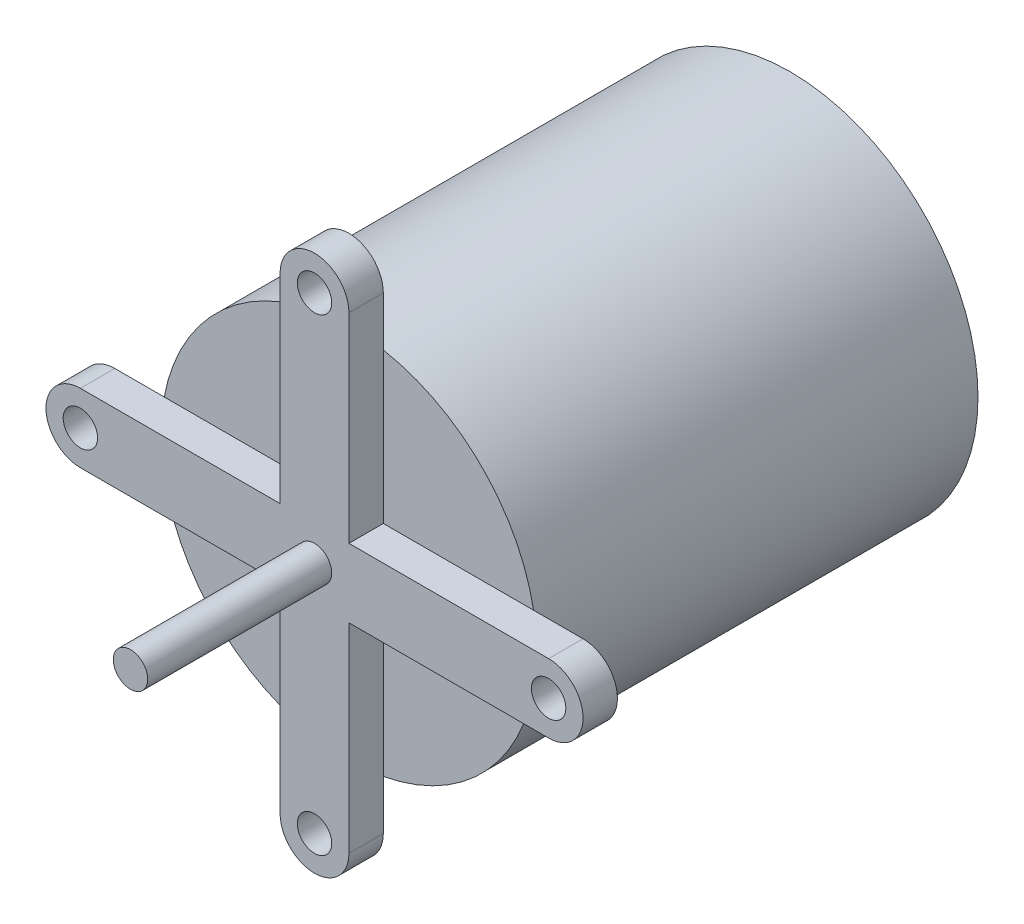
ISO-10303-21;
HEADER;
FILE_DESCRIPTION(('STEP AP214'),'2;1');
FILE_NAME('part.step','',(''),(''),'','','');
FILE_SCHEMA(('AUTOMOTIVE_DESIGN { 1 0 10303 214 1 1 1 1 }'));
ENDSEC;
DATA;
#1=APPLICATION_CONTEXT('core data for automotive mechanical design processes');
#2=APPLICATION_PROTOCOL_DEFINITION('international standard','automotive_design',2000,#1);
#3=PRODUCT_CONTEXT('',#1,'mechanical');
#4=PRODUCT('Part','Part','',(#3));
#5=PRODUCT_RELATED_PRODUCT_CATEGORY('part','',(#4));
#6=PRODUCT_DEFINITION_FORMATION('','',#4);
#7=PRODUCT_DEFINITION_CONTEXT('part definition',#1,'design');
#8=PRODUCT_DEFINITION('design','',#6,#7);
#9=PRODUCT_DEFINITION_SHAPE('','',#8);
#10=(LENGTH_UNIT() NAMED_UNIT(*) SI_UNIT(.MILLI.,.METRE.));
#11=(NAMED_UNIT(*) PLANE_ANGLE_UNIT() SI_UNIT($,.RADIAN.));
#12=(NAMED_UNIT(*) SI_UNIT($,.STERADIAN.) SOLID_ANGLE_UNIT());
#13=UNCERTAINTY_MEASURE_WITH_UNIT(LENGTH_MEASURE(1.E-05),#10,'distance_accuracy_value','');
#14=(GEOMETRIC_REPRESENTATION_CONTEXT(3) GLOBAL_UNCERTAINTY_ASSIGNED_CONTEXT((#13)) GLOBAL_UNIT_ASSIGNED_CONTEXT((#10,
#11,#12)) REPRESENTATION_CONTEXT('',''));
#15=CARTESIAN_POINT('',(0.,0.,0.));
#16=DIRECTION('',(0.,0.,1.));
#17=DIRECTION('',(1.,0.,0.));
#18=AXIS2_PLACEMENT_3D('',#15,#16,#17);
#19=CARTESIAN_POINT('',(0.,0.,25.654));
#20=DIRECTION('',(0.,0.,1.));
#21=DIRECTION('',(1.,0.,0.));
#22=AXIS2_PLACEMENT_3D('',#19,#20,#21);
#23=PLANE('',#22);
#24=CARTESIAN_POINT('',(0.,0.,25.654));
#25=DIRECTION('',(0.,0.,1.));
#26=DIRECTION('',(1.,0.,0.));
#27=AXIS2_PLACEMENT_3D('',#24,#25,#26);
#28=CIRCLE('',#27,10.922);
#29=CARTESIAN_POINT('',(10.7373227575585,1.999996,25.654));
#30=VERTEX_POINT('',#29);
#31=CARTESIAN_POINT('',(1.999996,10.7373227575585,25.654));
#32=VERTEX_POINT('',#31);
#33=EDGE_CURVE('E287',#30,#32,#28,.T.);
#34=ORIENTED_EDGE('',*,*,#33,.T.);
#35=DIRECTION('',(0.,-1.,0.));
#36=VECTOR('',#35,1.);
#37=CARTESIAN_POINT('',(1.999996,0.,25.654));
#38=LINE('',#37,#36);
#39=CARTESIAN_POINT('',(1.999996,1.999996,25.654));
#40=VERTEX_POINT('',#39);
#41=EDGE_CURVE('E11',#32,#40,#38,.T.);
#42=ORIENTED_EDGE('',*,*,#41,.T.);
#43=DIRECTION('',(-1.,0.,0.));
#44=VECTOR('',#43,1.);
#45=CARTESIAN_POINT('',(0.,1.999996,25.654));
#46=LINE('',#45,#44);
#47=EDGE_CURVE('E45',#30,#40,#46,.T.);
#48=ORIENTED_EDGE('',*,*,#47,.F.);
#49=EDGE_LOOP('',(#34,#42,#48));
#50=FACE_BOUND('',#49,.T.);
#51=ADVANCED_FACE('F36',(#50),#23,.T.);
#52=CARTESIAN_POINT('',(1.99999600000026,-10.7373227575585,25.654));
#53=VERTEX_POINT('',#52);
#54=CARTESIAN_POINT('',(10.7373227575585,-1.999996,25.654));
#55=VERTEX_POINT('',#54);
#56=EDGE_CURVE('E294',#53,#55,#28,.T.);
#57=ORIENTED_EDGE('',*,*,#56,.T.);
#58=DIRECTION('',(-1.,0.,0.));
#59=VECTOR('',#58,1.);
#60=CARTESIAN_POINT('',(0.,-1.999996,25.654));
#61=LINE('',#60,#59);
#62=CARTESIAN_POINT('',(1.99999600000026,-1.999996,25.654));
#63=VERTEX_POINT('',#62);
#64=EDGE_CURVE('E60',#55,#63,#61,.T.);
#65=ORIENTED_EDGE('',*,*,#64,.T.);
#66=DIRECTION('',(0.,1.,0.));
#67=VECTOR('',#66,1.);
#68=CARTESIAN_POINT('',(1.99999600000026,0.,25.654));
#69=LINE('',#68,#67);
#70=EDGE_CURVE('E245',#53,#63,#69,.T.);
#71=ORIENTED_EDGE('',*,*,#70,.F.);
#72=EDGE_LOOP('',(#57,#65,#71));
#73=FACE_BOUND('',#72,.T.);
#74=ADVANCED_FACE('F381',(#73),#23,.T.);
#75=CARTESIAN_POINT('',(-10.7373227575585,-1.999996,25.654));
#76=VERTEX_POINT('',#75);
#77=CARTESIAN_POINT('',(-1.9999959999998,-10.7373227575585,25.654));
#78=VERTEX_POINT('',#77);
#79=EDGE_CURVE('E300',#76,#78,#28,.T.);
#80=ORIENTED_EDGE('',*,*,#79,.T.);
#81=DIRECTION('',(0.,1.,0.));
#82=VECTOR('',#81,1.);
#83=CARTESIAN_POINT('',(-1.99999600000004,0.,25.654));
#84=LINE('',#83,#82);
#85=CARTESIAN_POINT('',(-1.99999599999999,-1.999996,25.654));
#86=VERTEX_POINT('',#85);
#87=EDGE_CURVE('E239',#78,#86,#84,.T.);
#88=ORIENTED_EDGE('',*,*,#87,.T.);
#89=DIRECTION('',(1.,0.,0.));
#90=VECTOR('',#89,1.);
#91=CARTESIAN_POINT('',(0.,-1.999996,25.654));
#92=LINE('',#91,#90);
#93=EDGE_CURVE('E235',#76,#86,#92,.T.);
#94=ORIENTED_EDGE('',*,*,#93,.F.);
#95=EDGE_LOOP('',(#80,#88,#94));
#96=FACE_BOUND('',#95,.T.);
#97=ADVANCED_FACE('F386',(#96),#23,.T.);
#98=CARTESIAN_POINT('',(-1.999996,10.7373227575585,25.654));
#99=VERTEX_POINT('',#98);
#100=CARTESIAN_POINT('',(-10.7373227575585,1.999996,25.654));
#101=VERTEX_POINT('',#100);
#102=EDGE_CURVE('E309',#99,#101,#28,.T.);
#103=ORIENTED_EDGE('',*,*,#102,.T.);
#104=DIRECTION('',(1.,0.,0.));
#105=VECTOR('',#104,1.);
#106=CARTESIAN_POINT('',(0.,1.999996,25.654));
#107=LINE('',#106,#105);
#108=CARTESIAN_POINT('',(-1.999996,1.999996,25.654));
#109=VERTEX_POINT('',#108);
#110=EDGE_CURVE('E229',#101,#109,#107,.T.);
#111=ORIENTED_EDGE('',*,*,#110,.T.);
#112=DIRECTION('',(0.,-1.,0.));
#113=VECTOR('',#112,1.);
#114=CARTESIAN_POINT('',(-1.999996,0.,25.654));
#115=LINE('',#114,#113);
#116=EDGE_CURVE('E225',#99,#109,#115,.T.);
#117=ORIENTED_EDGE('',*,*,#116,.F.);
#118=EDGE_LOOP('',(#103,#111,#117));
#119=FACE_BOUND('',#118,.T.);
#120=ADVANCED_FACE('F364',(#119),#23,.T.);
#121=CARTESIAN_POINT('',(0.,0.,25.654));
#122=DIRECTION('',(0.,0.,-1.));
#123=DIRECTION('',(-1.,0.,0.));
#124=AXIS2_PLACEMENT_3D('',#121,#122,#123);
#125=CYLINDRICAL_SURFACE('',#124,10.922);
#126=ORIENTED_EDGE('',*,*,#33,.F.);
#127=EDGE_CURVE('E289',#55,#30,#28,.T.);
#128=ORIENTED_EDGE('',*,*,#127,.F.);
#129=ORIENTED_EDGE('',*,*,#56,.F.);
#130=EDGE_CURVE('E297',#78,#53,#28,.T.);
#131=ORIENTED_EDGE('',*,*,#130,.F.);
#132=ORIENTED_EDGE('',*,*,#79,.F.);
#133=EDGE_CURVE('E304',#101,#76,#28,.T.);
#134=ORIENTED_EDGE('',*,*,#133,.F.);
#135=ORIENTED_EDGE('',*,*,#102,.F.);
#136=EDGE_CURVE('E288',#32,#99,#28,.T.);
#137=ORIENTED_EDGE('',*,*,#136,.F.);
#138=EDGE_LOOP('',(#126,#128,#129,#131,#132,#134,#135,#137));
#139=FACE_BOUND('',#138,.T.);
#140=CARTESIAN_POINT('',(0.,0.,0.));
#141=DIRECTION('',(0.,0.,1.));
#142=DIRECTION('',(1.,0.,0.));
#143=AXIS2_PLACEMENT_3D('',#140,#141,#142);
#144=CIRCLE('',#143,10.922);
#145=CARTESIAN_POINT('',(10.922,0.,0.));
#146=VERTEX_POINT('',#145);
#147=EDGE_CURVE('E161',#146,#146,#144,.T.);
#148=ORIENTED_EDGE('',*,*,#147,.T.);
#149=EDGE_LOOP('',(#148));
#150=FACE_BOUND('',#149,.T.);
#151=ADVANCED_FACE('F38',(#139,#150),#125,.T.);
#152=CARTESIAN_POINT('',(0.,0.,0.));
#153=DIRECTION('',(0.,0.,1.));
#154=DIRECTION('',(1.,0.,0.));
#155=AXIS2_PLACEMENT_3D('',#152,#153,#154);
#156=PLANE('',#155);
#157=ORIENTED_EDGE('',*,*,#147,.F.);
#158=EDGE_LOOP('',(#157));
#159=FACE_BOUND('',#158,.T.);
#160=ADVANCED_FACE('F376',(#159),#156,.F.);
#161=CARTESIAN_POINT('',(0.,0.,25.654));
#162=DIRECTION('',(0.,0.,1.));
#163=DIRECTION('',(1.,0.,0.));
#164=AXIS2_PLACEMENT_3D('',#161,#162,#163);
#165=PLANE('',#164);
#166=CARTESIAN_POINT('',(0.,13.61180000012,25.654));
#167=DIRECTION('',(0.,0.,1.));
#168=DIRECTION('',(1.,0.,0.));
#169=AXIS2_PLACEMENT_3D('',#166,#167,#168);
#170=CIRCLE('',#169,1.00000054);
#171=CARTESIAN_POINT('',(1.00000054,13.61180000012,25.654));
#172=VERTEX_POINT('',#171);
#173=EDGE_CURVE('E253',#172,#172,#170,.T.);
#174=ORIENTED_EDGE('',*,*,#173,.T.);
#175=EDGE_LOOP('',(#174));
#176=FACE_BOUND('',#175,.T.);
#177=CARTESIAN_POINT('',(1.999996,13.61180000012,25.654));
#178=VERTEX_POINT('',#177);
#179=EDGE_CURVE('E47',#178,#32,#38,.T.);
#180=ORIENTED_EDGE('',*,*,#179,.T.);
#181=ORIENTED_EDGE('',*,*,#136,.T.);
#182=CARTESIAN_POINT('',(-1.999996,13.61180000012,25.654));
#183=VERTEX_POINT('',#182);
#184=EDGE_CURVE('E221',#183,#99,#115,.T.);
#185=ORIENTED_EDGE('',*,*,#184,.F.);
#186=CARTESIAN_POINT('',(0.,13.61180000012,25.654));
#187=DIRECTION('',(0.,0.,1.));
#188=DIRECTION('',(1.,0.,0.));
#189=AXIS2_PLACEMENT_3D('',#186,#187,#188);
#190=CIRCLE('',#189,1.999996);
#191=EDGE_CURVE('E219',#178,#183,#190,.T.);
#192=ORIENTED_EDGE('',*,*,#191,.F.);
#193=EDGE_LOOP('',(#180,#181,#185,#192));
#194=FACE_BOUND('',#193,.T.);
#195=ADVANCED_FACE('F319',(#176,#194),#165,.F.);
#196=CARTESIAN_POINT('',(-13.61180000012,0.,25.654));
#197=DIRECTION('',(0.,0.,1.));
#198=DIRECTION('',(1.,0.,0.));
#199=AXIS2_PLACEMENT_3D('',#196,#197,#198);
#200=CIRCLE('',#199,1.00000053999996);
#201=CARTESIAN_POINT('',(-12.61179946012,0.,25.654));
#202=VERTEX_POINT('',#201);
#203=EDGE_CURVE('E180',#202,#202,#200,.T.);
#204=ORIENTED_EDGE('',*,*,#203,.T.);
#205=EDGE_LOOP('',(#204));
#206=FACE_BOUND('',#205,.T.);
#207=CARTESIAN_POINT('',(-13.61180000012,1.999996,25.654));
#208=VERTEX_POINT('',#207);
#209=EDGE_CURVE('E224',#208,#101,#107,.T.);
#210=ORIENTED_EDGE('',*,*,#209,.T.);
#211=ORIENTED_EDGE('',*,*,#133,.T.);
#212=CARTESIAN_POINT('',(-13.61180000012,-1.999996,25.654));
#213=VERTEX_POINT('',#212);
#214=EDGE_CURVE('E231',#213,#76,#92,.T.);
#215=ORIENTED_EDGE('',*,*,#214,.F.);
#216=CARTESIAN_POINT('',(-13.61180000012,0.,25.654));
#217=DIRECTION('',(0.,0.,1.));
#218=DIRECTION('',(1.,0.,0.));
#219=AXIS2_PLACEMENT_3D('',#216,#217,#218);
#220=CIRCLE('',#219,1.999996);
#221=EDGE_CURVE('E228',#208,#213,#220,.T.);
#222=ORIENTED_EDGE('',*,*,#221,.F.);
#223=EDGE_LOOP('',(#210,#211,#215,#222));
#224=FACE_BOUND('',#223,.T.);
#225=ADVANCED_FACE('F365',(#206,#224),#165,.F.);
#226=CARTESIAN_POINT('',(2.60344038888319E-13,-13.61180000012,25.654));
#227=DIRECTION('',(0.,0.,1.));
#228=DIRECTION('',(1.,0.,0.));
#229=AXIS2_PLACEMENT_3D('',#226,#227,#228);
#230=CIRCLE('',#229,1.00000054000016);
#231=CARTESIAN_POINT('',(1.00000054000042,-13.61180000012,25.654));
#232=VERTEX_POINT('',#231);
#233=EDGE_CURVE('E256',#232,#232,#230,.T.);
#234=ORIENTED_EDGE('',*,*,#233,.T.);
#235=EDGE_LOOP('',(#234));
#236=FACE_BOUND('',#235,.T.);
#237=CARTESIAN_POINT('',(-1.99999599999974,-13.61180000012,25.654));
#238=VERTEX_POINT('',#237);
#239=EDGE_CURVE('E234',#238,#78,#84,.T.);
#240=ORIENTED_EDGE('',*,*,#239,.T.);
#241=ORIENTED_EDGE('',*,*,#130,.T.);
#242=CARTESIAN_POINT('',(1.99999600000026,-13.61180000012,25.654));
#243=VERTEX_POINT('',#242);
#244=EDGE_CURVE('E241',#243,#53,#69,.T.);
#245=ORIENTED_EDGE('',*,*,#244,.F.);
#246=CARTESIAN_POINT('',(2.60344038888319E-13,-13.61180000012,25.654));
#247=DIRECTION('',(0.,0.,1.));
#248=DIRECTION('',(1.,0.,0.));
#249=AXIS2_PLACEMENT_3D('',#246,#247,#248);
#250=CIRCLE('',#249,1.999996);
#251=EDGE_CURVE('E238',#238,#243,#250,.T.);
#252=ORIENTED_EDGE('',*,*,#251,.F.);
#253=EDGE_LOOP('',(#240,#241,#245,#252));
#254=FACE_BOUND('',#253,.T.);
#255=ADVANCED_FACE('F367',(#236,#254),#165,.F.);
#256=CARTESIAN_POINT('',(13.6118000001203,0.,25.654));
#257=DIRECTION('',(0.,0.,1.));
#258=DIRECTION('',(1.,0.,0.));
#259=AXIS2_PLACEMENT_3D('',#256,#257,#258);
#260=CIRCLE('',#259,1.00000053999979);
#261=CARTESIAN_POINT('',(14.61180054012,0.,25.654));
#262=VERTEX_POINT('',#261);
#263=EDGE_CURVE('E177',#262,#262,#260,.T.);
#264=ORIENTED_EDGE('',*,*,#263,.T.);
#265=EDGE_LOOP('',(#264));
#266=FACE_BOUND('',#265,.T.);
#267=CARTESIAN_POINT('',(13.6118000001203,-1.999996,25.654));
#268=VERTEX_POINT('',#267);
#269=EDGE_CURVE('E244',#268,#55,#61,.T.);
#270=ORIENTED_EDGE('',*,*,#269,.T.);
#271=ORIENTED_EDGE('',*,*,#127,.T.);
#272=CARTESIAN_POINT('',(13.6118000001203,1.999996,25.654));
#273=VERTEX_POINT('',#272);
#274=EDGE_CURVE('E250',#273,#30,#46,.T.);
#275=ORIENTED_EDGE('',*,*,#274,.F.);
#276=CARTESIAN_POINT('',(13.6118000001203,0.,25.654));
#277=DIRECTION('',(0.,0.,1.));
#278=DIRECTION('',(1.,0.,0.));
#279=AXIS2_PLACEMENT_3D('',#276,#277,#278);
#280=CIRCLE('',#279,1.999996);
#281=EDGE_CURVE('E248',#268,#273,#280,.T.);
#282=ORIENTED_EDGE('',*,*,#281,.F.);
#283=EDGE_LOOP('',(#270,#271,#275,#282));
#284=FACE_BOUND('',#283,.T.);
#285=ADVANCED_FACE('F374',(#266,#284),#165,.F.);
#286=CARTESIAN_POINT('',(1.999996,0.,27.65400108));
#287=DIRECTION('',(1.,0.,0.));
#288=DIRECTION('',(0.,1.,0.));
#289=AXIS2_PLACEMENT_3D('',#286,#287,#288);
#290=PLANE('',#289);
#291=ORIENTED_EDGE('',*,*,#179,.F.);
#292=DIRECTION('',(0.,0.,-1.));
#293=VECTOR('',#292,1.);
#294=CARTESIAN_POINT('',(1.999996,13.61180000012,27.65400108));
#295=LINE('',#294,#293);
#296=CARTESIAN_POINT('',(1.999996,13.61180000012,27.65400108));
#297=VERTEX_POINT('',#296);
#298=EDGE_CURVE('E152',#297,#178,#295,.T.);
#299=ORIENTED_EDGE('',*,*,#298,.F.);
#300=DIRECTION('',(0.,-1.,0.));
#301=VECTOR('',#300,1.);
#302=CARTESIAN_POINT('',(1.999996,0.,27.65400108));
#303=LINE('',#302,#301);
#304=CARTESIAN_POINT('',(1.999996,1.999996,27.65400108));
#305=VERTEX_POINT('',#304);
#306=EDGE_CURVE('E157',#297,#305,#303,.T.);
#307=ORIENTED_EDGE('',*,*,#306,.T.);
#308=DIRECTION('',(0.,0.,-1.));
#309=VECTOR('',#308,1.);
#310=CARTESIAN_POINT('',(1.999996,1.999996,27.65400108));
#311=LINE('',#310,#309);
#312=EDGE_CURVE('E217',#305,#40,#311,.T.);
#313=ORIENTED_EDGE('',*,*,#312,.T.);
#314=ORIENTED_EDGE('',*,*,#41,.F.);
#315=EDGE_LOOP('',(#291,#299,#307,#313,#314));
#316=FACE_BOUND('',#315,.T.);
#317=ADVANCED_FACE('F154',(#316),#290,.T.);
#318=CARTESIAN_POINT('',(0.,13.61180000012,27.65400108));
#319=DIRECTION('',(0.,0.,-1.));
#320=DIRECTION('',(-1.,0.,0.));
#321=AXIS2_PLACEMENT_3D('',#318,#319,#320);
#322=CYLINDRICAL_SURFACE('',#321,1.999996);
#323=ORIENTED_EDGE('',*,*,#191,.T.);
#324=DIRECTION('',(0.,0.,-1.));
#325=VECTOR('',#324,1.);
#326=CARTESIAN_POINT('',(-1.999996,13.61180000012,27.65400108));
#327=LINE('',#326,#325);
#328=CARTESIAN_POINT('',(-1.999996,13.61180000012,27.65400108));
#329=VERTEX_POINT('',#328);
#330=EDGE_CURVE('E162',#329,#183,#327,.T.);
#331=ORIENTED_EDGE('',*,*,#330,.F.);
#332=CARTESIAN_POINT('',(0.,13.61180000012,27.65400108));
#333=DIRECTION('',(0.,0.,1.));
#334=DIRECTION('',(1.,0.,0.));
#335=AXIS2_PLACEMENT_3D('',#332,#333,#334);
#336=CIRCLE('',#335,1.999996);
#337=EDGE_CURVE('E165',#297,#329,#336,.T.);
#338=ORIENTED_EDGE('',*,*,#337,.F.);
#339=ORIENTED_EDGE('',*,*,#298,.T.);
#340=EDGE_LOOP('',(#323,#331,#338,#339));
#341=FACE_BOUND('',#340,.T.);
#342=ADVANCED_FACE('F166',(#341),#322,.T.);
#343=CARTESIAN_POINT('',(-1.999996,0.,27.65400108));
#344=DIRECTION('',(1.,0.,0.));
#345=DIRECTION('',(0.,1.,0.));
#346=AXIS2_PLACEMENT_3D('',#343,#344,#345);
#347=PLANE('',#346);
#348=ORIENTED_EDGE('',*,*,#184,.T.);
#349=ORIENTED_EDGE('',*,*,#116,.T.);
#350=DIRECTION('',(0.,0.,-1.));
#351=VECTOR('',#350,1.);
#352=CARTESIAN_POINT('',(-1.999996,1.999996,27.65400108));
#353=LINE('',#352,#351);
#354=CARTESIAN_POINT('',(-1.999996,1.999996,27.65400108));
#355=VERTEX_POINT('',#354);
#356=EDGE_CURVE('E283',#355,#109,#353,.T.);
#357=ORIENTED_EDGE('',*,*,#356,.F.);
#358=DIRECTION('',(0.,-1.,0.));
#359=VECTOR('',#358,1.);
#360=CARTESIAN_POINT('',(-1.999996,0.,27.65400108));
#361=LINE('',#360,#359);
#362=EDGE_CURVE('E170',#329,#355,#361,.T.);
#363=ORIENTED_EDGE('',*,*,#362,.F.);
#364=ORIENTED_EDGE('',*,*,#330,.T.);
#365=EDGE_LOOP('',(#348,#349,#357,#363,#364));
#366=FACE_BOUND('',#365,.T.);
#367=ADVANCED_FACE('F324',(#366),#347,.F.);
#368=CARTESIAN_POINT('',(0.,1.999996,27.65400108));
#369=DIRECTION('',(0.,1.,0.));
#370=DIRECTION('',(-1.,0.,0.));
#371=AXIS2_PLACEMENT_3D('',#368,#369,#370);
#372=PLANE('',#371);
#373=ORIENTED_EDGE('',*,*,#209,.F.);
#374=DIRECTION('',(0.,0.,-1.));
#375=VECTOR('',#374,1.);
#376=CARTESIAN_POINT('',(-13.61180000012,1.999996,27.65400108));
#377=LINE('',#376,#375);
#378=CARTESIAN_POINT('',(-13.61180000012,1.999996,27.65400108));
#379=VERTEX_POINT('',#378);
#380=EDGE_CURVE('E281',#379,#208,#377,.T.);
#381=ORIENTED_EDGE('',*,*,#380,.F.);
#382=DIRECTION('',(1.,0.,0.));
#383=VECTOR('',#382,1.);
#384=CARTESIAN_POINT('',(0.,1.999996,27.65400108));
#385=LINE('',#384,#383);
#386=EDGE_CURVE('E186',#379,#355,#385,.T.);
#387=ORIENTED_EDGE('',*,*,#386,.T.);
#388=ORIENTED_EDGE('',*,*,#356,.T.);
#389=ORIENTED_EDGE('',*,*,#110,.F.);
#390=EDGE_LOOP('',(#373,#381,#387,#388,#389));
#391=FACE_BOUND('',#390,.T.);
#392=ADVANCED_FACE('F331',(#391),#372,.T.);
#393=CARTESIAN_POINT('',(-13.61180000012,0.,27.65400108));
#394=DIRECTION('',(0.,0.,-1.));
#395=DIRECTION('',(-1.,0.,0.));
#396=AXIS2_PLACEMENT_3D('',#393,#394,#395);
#397=CYLINDRICAL_SURFACE('',#396,1.999996);
#398=ORIENTED_EDGE('',*,*,#221,.T.);
#399=DIRECTION('',(0.,0.,-1.));
#400=VECTOR('',#399,1.);
#401=CARTESIAN_POINT('',(-13.61180000012,-1.999996,27.65400108));
#402=LINE('',#401,#400);
#403=CARTESIAN_POINT('',(-13.61180000012,-1.999996,27.65400108));
#404=VERTEX_POINT('',#403);
#405=EDGE_CURVE('E278',#404,#213,#402,.T.);
#406=ORIENTED_EDGE('',*,*,#405,.F.);
#407=CARTESIAN_POINT('',(-13.61180000012,0.,27.65400108));
#408=DIRECTION('',(0.,0.,1.));
#409=DIRECTION('',(1.,0.,0.));
#410=AXIS2_PLACEMENT_3D('',#407,#408,#409);
#411=CIRCLE('',#410,1.999996);
#412=EDGE_CURVE('E189',#379,#404,#411,.T.);
#413=ORIENTED_EDGE('',*,*,#412,.F.);
#414=ORIENTED_EDGE('',*,*,#380,.T.);
#415=EDGE_LOOP('',(#398,#406,#413,#414));
#416=FACE_BOUND('',#415,.T.);
#417=ADVANCED_FACE('F334',(#416),#397,.T.);
#418=CARTESIAN_POINT('',(0.,-1.999996,27.65400108));
#419=DIRECTION('',(0.,1.,0.));
#420=DIRECTION('',(-1.,0.,0.));
#421=AXIS2_PLACEMENT_3D('',#418,#419,#420);
#422=PLANE('',#421);
#423=ORIENTED_EDGE('',*,*,#214,.T.);
#424=ORIENTED_EDGE('',*,*,#93,.T.);
#425=DIRECTION('',(0.,0.,-1.));
#426=VECTOR('',#425,1.);
#427=CARTESIAN_POINT('',(-1.99999599999999,-1.999996,27.65400108));
#428=LINE('',#427,#426);
#429=CARTESIAN_POINT('',(-1.99999599999999,-1.999996,27.65400108));
#430=VERTEX_POINT('',#429);
#431=EDGE_CURVE('E275',#430,#86,#428,.T.);
#432=ORIENTED_EDGE('',*,*,#431,.F.);
#433=DIRECTION('',(1.,0.,0.));
#434=VECTOR('',#433,1.);
#435=CARTESIAN_POINT('',(0.,-1.999996,27.65400108));
#436=LINE('',#435,#434);
#437=EDGE_CURVE('E191',#404,#430,#436,.T.);
#438=ORIENTED_EDGE('',*,*,#437,.F.);
#439=ORIENTED_EDGE('',*,*,#405,.T.);
#440=EDGE_LOOP('',(#423,#424,#432,#438,#439));
#441=FACE_BOUND('',#440,.T.);
#442=ADVANCED_FACE('F338',(#441),#422,.F.);
#443=CARTESIAN_POINT('',(-1.99999600000004,0.,27.65400108));
#444=DIRECTION('',(-1.,0.,0.));
#445=DIRECTION('',(0.,-1.,0.));
#446=AXIS2_PLACEMENT_3D('',#443,#444,#445);
#447=PLANE('',#446);
#448=ORIENTED_EDGE('',*,*,#239,.F.);
#449=DIRECTION('',(0.,0.,-1.));
#450=VECTOR('',#449,1.);
#451=CARTESIAN_POINT('',(-1.99999599999974,-13.61180000012,27.65400108));
#452=LINE('',#451,#450);
#453=CARTESIAN_POINT('',(-1.99999599999974,-13.61180000012,27.65400108));
#454=VERTEX_POINT('',#453);
#455=EDGE_CURVE('E273',#454,#238,#452,.T.);
#456=ORIENTED_EDGE('',*,*,#455,.F.);
#457=DIRECTION('',(0.,1.,0.));
#458=VECTOR('',#457,1.);
#459=CARTESIAN_POINT('',(-1.99999600000004,0.,27.65400108));
#460=LINE('',#459,#458);
#461=EDGE_CURVE('E193',#454,#430,#460,.T.);
#462=ORIENTED_EDGE('',*,*,#461,.T.);
#463=ORIENTED_EDGE('',*,*,#431,.T.);
#464=ORIENTED_EDGE('',*,*,#87,.F.);
#465=EDGE_LOOP('',(#448,#456,#462,#463,#464));
#466=FACE_BOUND('',#465,.T.);
#467=ADVANCED_FACE('F345',(#466),#447,.T.);
#468=CARTESIAN_POINT('',(2.60344038888319E-13,-13.61180000012,27.65400108));
#469=DIRECTION('',(0.,0.,-1.));
#470=DIRECTION('',(-1.,0.,0.));
#471=AXIS2_PLACEMENT_3D('',#468,#469,#470);
#472=CYLINDRICAL_SURFACE('',#471,1.999996);
#473=ORIENTED_EDGE('',*,*,#251,.T.);
#474=DIRECTION('',(0.,0.,-1.));
#475=VECTOR('',#474,1.);
#476=CARTESIAN_POINT('',(1.99999600000026,-13.61180000012,27.65400108));
#477=LINE('',#476,#475);
#478=CARTESIAN_POINT('',(1.99999600000026,-13.61180000012,27.65400108));
#479=VERTEX_POINT('',#478);
#480=EDGE_CURVE('E270',#479,#243,#477,.T.);
#481=ORIENTED_EDGE('',*,*,#480,.F.);
#482=CARTESIAN_POINT('',(2.60344038888319E-13,-13.61180000012,27.65400108));
#483=DIRECTION('',(0.,0.,1.));
#484=DIRECTION('',(1.,0.,0.));
#485=AXIS2_PLACEMENT_3D('',#482,#483,#484);
#486=CIRCLE('',#485,1.999996);
#487=EDGE_CURVE('E196',#454,#479,#486,.T.);
#488=ORIENTED_EDGE('',*,*,#487,.F.);
#489=ORIENTED_EDGE('',*,*,#455,.T.);
#490=EDGE_LOOP('',(#473,#481,#488,#489));
#491=FACE_BOUND('',#490,.T.);
#492=ADVANCED_FACE('F348',(#491),#472,.T.);
#493=CARTESIAN_POINT('',(1.99999600000026,0.,27.65400108));
#494=DIRECTION('',(-1.,0.,0.));
#495=DIRECTION('',(0.,-1.,0.));
#496=AXIS2_PLACEMENT_3D('',#493,#494,#495);
#497=PLANE('',#496);
#498=ORIENTED_EDGE('',*,*,#244,.T.);
#499=ORIENTED_EDGE('',*,*,#70,.T.);
#500=DIRECTION('',(0.,0.,-1.));
#501=VECTOR('',#500,1.);
#502=CARTESIAN_POINT('',(1.99999600000026,-1.999996,27.65400108));
#503=LINE('',#502,#501);
#504=CARTESIAN_POINT('',(1.99999600000026,-1.999996,27.65400108));
#505=VERTEX_POINT('',#504);
#506=EDGE_CURVE('E267',#505,#63,#503,.T.);
#507=ORIENTED_EDGE('',*,*,#506,.F.);
#508=DIRECTION('',(0.,1.,0.));
#509=VECTOR('',#508,1.);
#510=CARTESIAN_POINT('',(1.99999600000026,0.,27.65400108));
#511=LINE('',#510,#509);
#512=EDGE_CURVE('E198',#479,#505,#511,.T.);
#513=ORIENTED_EDGE('',*,*,#512,.F.);
#514=ORIENTED_EDGE('',*,*,#480,.T.);
#515=EDGE_LOOP('',(#498,#499,#507,#513,#514));
#516=FACE_BOUND('',#515,.T.);
#517=ADVANCED_FACE('F352',(#516),#497,.F.);
#518=CARTESIAN_POINT('',(0.,-1.999996,27.65400108));
#519=DIRECTION('',(0.,-1.,0.));
#520=DIRECTION('',(1.,0.,0.));
#521=AXIS2_PLACEMENT_3D('',#518,#519,#520);
#522=PLANE('',#521);
#523=ORIENTED_EDGE('',*,*,#269,.F.);
#524=DIRECTION('',(0.,0.,-1.));
#525=VECTOR('',#524,1.);
#526=CARTESIAN_POINT('',(13.6118000001203,-1.999996,27.65400108));
#527=LINE('',#526,#525);
#528=CARTESIAN_POINT('',(13.6118000001203,-1.999996,27.65400108));
#529=VERTEX_POINT('',#528);
#530=EDGE_CURVE('E265',#529,#268,#527,.T.);
#531=ORIENTED_EDGE('',*,*,#530,.F.);
#532=DIRECTION('',(-1.,0.,0.));
#533=VECTOR('',#532,1.);
#534=CARTESIAN_POINT('',(0.,-1.999996,27.65400108));
#535=LINE('',#534,#533);
#536=EDGE_CURVE('E200',#529,#505,#535,.T.);
#537=ORIENTED_EDGE('',*,*,#536,.T.);
#538=ORIENTED_EDGE('',*,*,#506,.T.);
#539=ORIENTED_EDGE('',*,*,#64,.F.);
#540=EDGE_LOOP('',(#523,#531,#537,#538,#539));
#541=FACE_BOUND('',#540,.T.);
#542=ADVANCED_FACE('F358',(#541),#522,.T.);
#543=CARTESIAN_POINT('',(13.6118000001203,0.,27.65400108));
#544=DIRECTION('',(0.,0.,-1.));
#545=DIRECTION('',(-1.,0.,0.));
#546=AXIS2_PLACEMENT_3D('',#543,#544,#545);
#547=CYLINDRICAL_SURFACE('',#546,1.999996);
#548=ORIENTED_EDGE('',*,*,#281,.T.);
#549=DIRECTION('',(0.,0.,-1.));
#550=VECTOR('',#549,1.);
#551=CARTESIAN_POINT('',(13.6118000001203,1.999996,27.65400108));
#552=LINE('',#551,#550);
#553=CARTESIAN_POINT('',(13.6118000001203,1.999996,27.65400108));
#554=VERTEX_POINT('',#553);
#555=EDGE_CURVE('E262',#554,#273,#552,.T.);
#556=ORIENTED_EDGE('',*,*,#555,.F.);
#557=CARTESIAN_POINT('',(13.6118000001203,0.,27.65400108));
#558=DIRECTION('',(0.,0.,1.));
#559=DIRECTION('',(1.,0.,0.));
#560=AXIS2_PLACEMENT_3D('',#557,#558,#559);
#561=CIRCLE('',#560,1.999996);
#562=EDGE_CURVE('E203',#529,#554,#561,.T.);
#563=ORIENTED_EDGE('',*,*,#562,.F.);
#564=ORIENTED_EDGE('',*,*,#530,.T.);
#565=EDGE_LOOP('',(#548,#556,#563,#564));
#566=FACE_BOUND('',#565,.T.);
#567=ADVANCED_FACE('F361',(#566),#547,.T.);
#568=CARTESIAN_POINT('',(-13.61180000012,0.,27.65400108));
#569=DIRECTION('',(0.,0.,-1.));
#570=DIRECTION('',(-1.,0.,0.));
#571=AXIS2_PLACEMENT_3D('',#568,#569,#570);
#572=CYLINDRICAL_SURFACE('',#571,1.00000053999996);
#573=CARTESIAN_POINT('',(-13.61180000012,0.,27.65400108));
#574=DIRECTION('',(0.,0.,1.));
#575=DIRECTION('',(1.,0.,0.));
#576=AXIS2_PLACEMENT_3D('',#573,#574,#575);
#577=CIRCLE('',#576,1.00000053999996);
#578=CARTESIAN_POINT('',(-12.61179946012,0.,27.65400108));
#579=VERTEX_POINT('',#578);
#580=EDGE_CURVE('E212',#579,#579,#577,.T.);
#581=ORIENTED_EDGE('',*,*,#580,.T.);
#582=EDGE_LOOP('',(#581));
#583=FACE_BOUND('',#582,.T.);
#584=ORIENTED_EDGE('',*,*,#203,.F.);
#585=EDGE_LOOP('',(#584));
#586=FACE_BOUND('',#585,.T.);
#587=ADVANCED_FACE('F536',(#583,#586),#572,.F.);
#588=CARTESIAN_POINT('',(2.60344038888319E-13,-13.61180000012,27.65400108));
#589=DIRECTION('',(0.,0.,-1.));
#590=DIRECTION('',(-1.,0.,0.));
#591=AXIS2_PLACEMENT_3D('',#588,#589,#590);
#592=CYLINDRICAL_SURFACE('',#591,1.00000054000016);
#593=CARTESIAN_POINT('',(2.60344038888319E-13,-13.61180000012,27.65400108));
#594=DIRECTION('',(0.,0.,1.));
#595=DIRECTION('',(1.,0.,0.));
#596=AXIS2_PLACEMENT_3D('',#593,#594,#595);
#597=CIRCLE('',#596,1.00000054000016);
#598=CARTESIAN_POINT('',(1.00000054000042,-13.61180000012,27.65400108));
#599=VERTEX_POINT('',#598);
#600=EDGE_CURVE('E209',#599,#599,#597,.T.);
#601=ORIENTED_EDGE('',*,*,#600,.T.);
#602=EDGE_LOOP('',(#601));
#603=FACE_BOUND('',#602,.T.);
#604=ORIENTED_EDGE('',*,*,#233,.F.);
#605=EDGE_LOOP('',(#604));
#606=FACE_BOUND('',#605,.T.);
#607=ADVANCED_FACE('F545',(#603,#606),#592,.F.);
#608=CARTESIAN_POINT('',(0.,13.61180000012,27.65400108));
#609=DIRECTION('',(0.,0.,-1.));
#610=DIRECTION('',(-1.,0.,0.));
#611=AXIS2_PLACEMENT_3D('',#608,#609,#610);
#612=CYLINDRICAL_SURFACE('',#611,1.00000054);
#613=CARTESIAN_POINT('',(0.,13.61180000012,27.65400108));
#614=DIRECTION('',(0.,0.,1.));
#615=DIRECTION('',(1.,0.,0.));
#616=AXIS2_PLACEMENT_3D('',#613,#614,#615);
#617=CIRCLE('',#616,1.00000054);
#618=CARTESIAN_POINT('',(1.00000054,13.61180000012,27.65400108));
#619=VERTEX_POINT('',#618);
#620=EDGE_CURVE('E206',#619,#619,#617,.T.);
#621=ORIENTED_EDGE('',*,*,#620,.T.);
#622=EDGE_LOOP('',(#621));
#623=FACE_BOUND('',#622,.T.);
#624=ORIENTED_EDGE('',*,*,#173,.F.);
#625=EDGE_LOOP('',(#624));
#626=FACE_BOUND('',#625,.T.);
#627=ADVANCED_FACE('F555',(#623,#626),#612,.F.);
#628=CARTESIAN_POINT('',(0.,1.999996,27.65400108));
#629=DIRECTION('',(0.,-1.,0.));
#630=DIRECTION('',(1.,0.,0.));
#631=AXIS2_PLACEMENT_3D('',#628,#629,#630);
#632=PLANE('',#631);
#633=ORIENTED_EDGE('',*,*,#274,.T.);
#634=ORIENTED_EDGE('',*,*,#47,.T.);
#635=ORIENTED_EDGE('',*,*,#312,.F.);
#636=DIRECTION('',(-1.,0.,0.));
#637=VECTOR('',#636,1.);
#638=CARTESIAN_POINT('',(0.,1.999996,27.65400108));
#639=LINE('',#638,#637);
#640=EDGE_CURVE('E175',#554,#305,#639,.T.);
#641=ORIENTED_EDGE('',*,*,#640,.F.);
#642=ORIENTED_EDGE('',*,*,#555,.T.);
#643=EDGE_LOOP('',(#633,#634,#635,#641,#642));
#644=FACE_BOUND('',#643,.T.);
#645=ADVANCED_FACE('F363',(#644),#632,.F.);
#646=CARTESIAN_POINT('',(13.6118000001203,0.,27.65400108));
#647=DIRECTION('',(0.,0.,-1.));
#648=DIRECTION('',(-1.,0.,0.));
#649=AXIS2_PLACEMENT_3D('',#646,#647,#648);
#650=CYLINDRICAL_SURFACE('',#649,1.00000053999979);
#651=CARTESIAN_POINT('',(13.6118000001203,0.,27.65400108));
#652=DIRECTION('',(0.,0.,1.));
#653=DIRECTION('',(1.,0.,0.));
#654=AXIS2_PLACEMENT_3D('',#651,#652,#653);
#655=CIRCLE('',#654,1.00000053999979);
#656=CARTESIAN_POINT('',(14.61180054012,0.,27.65400108));
#657=VERTEX_POINT('',#656);
#658=EDGE_CURVE('E215',#657,#657,#655,.T.);
#659=ORIENTED_EDGE('',*,*,#658,.T.);
#660=EDGE_LOOP('',(#659));
#661=FACE_BOUND('',#660,.T.);
#662=ORIENTED_EDGE('',*,*,#263,.F.);
#663=EDGE_LOOP('',(#662));
#664=FACE_BOUND('',#663,.T.);
#665=ADVANCED_FACE('F574',(#661,#664),#650,.F.);
#666=CARTESIAN_POINT('',(0.,0.,27.65400108));
#667=DIRECTION('',(0.,0.,1.));
#668=DIRECTION('',(1.,0.,0.));
#669=AXIS2_PLACEMENT_3D('',#666,#667,#668);
#670=PLANE('',#669);
#671=CARTESIAN_POINT('',(0.,0.,27.65400108));
#672=DIRECTION('',(0.,0.,1.));
#673=DIRECTION('',(1.,0.,0.));
#674=AXIS2_PLACEMENT_3D('',#671,#672,#673);
#675=CIRCLE('',#674,1.00000054);
#676=CARTESIAN_POINT('',(1.00000054,0.,27.65400108));
#677=VERTEX_POINT('',#676);
#678=EDGE_CURVE('E40',#677,#677,#675,.F.);
#679=ORIENTED_EDGE('',*,*,#678,.T.);
#680=EDGE_LOOP('',(#679));
#681=FACE_BOUND('',#680,.T.);
#682=ORIENTED_EDGE('',*,*,#306,.F.);
#683=ORIENTED_EDGE('',*,*,#337,.T.);
#684=ORIENTED_EDGE('',*,*,#362,.T.);
#685=ORIENTED_EDGE('',*,*,#386,.F.);
#686=ORIENTED_EDGE('',*,*,#412,.T.);
#687=ORIENTED_EDGE('',*,*,#437,.T.);
#688=ORIENTED_EDGE('',*,*,#461,.F.);
#689=ORIENTED_EDGE('',*,*,#487,.T.);
#690=ORIENTED_EDGE('',*,*,#512,.T.);
#691=ORIENTED_EDGE('',*,*,#536,.F.);
#692=ORIENTED_EDGE('',*,*,#562,.T.);
#693=ORIENTED_EDGE('',*,*,#640,.T.);
#694=EDGE_LOOP('',(#682,#683,#684,#685,#686,#687,#688,#689,#690,#691,#692,#693));
#695=FACE_BOUND('',#694,.T.);
#696=ORIENTED_EDGE('',*,*,#620,.F.);
#697=EDGE_LOOP('',(#696));
#698=FACE_BOUND('',#697,.T.);
#699=ORIENTED_EDGE('',*,*,#600,.F.);
#700=EDGE_LOOP('',(#699));
#701=FACE_BOUND('',#700,.T.);
#702=ORIENTED_EDGE('',*,*,#580,.F.);
#703=EDGE_LOOP('',(#702));
#704=FACE_BOUND('',#703,.T.);
#705=ORIENTED_EDGE('',*,*,#658,.F.);
#706=EDGE_LOOP('',(#705));
#707=FACE_BOUND('',#706,.T.);
#708=ADVANCED_FACE('F172',(#681,#695,#698,#701,#704,#707),#670,.T.);
#709=CARTESIAN_POINT('',(0.,0.,38.354));
#710=DIRECTION('',(0.,0.,-1.));
#711=DIRECTION('',(-1.,0.,0.));
#712=AXIS2_PLACEMENT_3D('',#709,#710,#711);
#713=CYLINDRICAL_SURFACE('',#712,1.00000054);
#714=ORIENTED_EDGE('',*,*,#678,.F.);
#715=EDGE_LOOP('',(#714));
#716=FACE_BOUND('',#715,.T.);
#717=CARTESIAN_POINT('',(0.,0.,38.354));
#718=DIRECTION('',(0.,0.,1.));
#719=DIRECTION('',(1.,0.,0.));
#720=AXIS2_PLACEMENT_3D('',#717,#718,#719);
#721=CIRCLE('',#720,1.00000054);
#722=CARTESIAN_POINT('',(1.00000054,0.,38.354));
#723=VERTEX_POINT('',#722);
#724=EDGE_CURVE('E183',#723,#723,#721,.T.);
#725=ORIENTED_EDGE('',*,*,#724,.F.);
#726=EDGE_LOOP('',(#725));
#727=FACE_BOUND('',#726,.T.);
#728=ADVANCED_FACE('F592',(#716,#727),#713,.T.);
#729=CARTESIAN_POINT('',(0.,0.,38.354));
#730=DIRECTION('',(0.,0.,1.));
#731=DIRECTION('',(1.,0.,0.));
#732=AXIS2_PLACEMENT_3D('',#729,#730,#731);
#733=PLANE('',#732);
#734=ORIENTED_EDGE('',*,*,#724,.T.);
#735=EDGE_LOOP('',(#734));
#736=FACE_BOUND('',#735,.T.);
#737=ADVANCED_FACE('F602',(#736),#733,.T.);
#738=CLOSED_SHELL('',(#51,#74,#97,#120,#151,#160,#195,#225,#255,#285,#317,#342,#367,#392,#417,
#442,#467,#492,#517,#542,#567,#587,#607,#627,#645,#665,#708,#728,#737));
#739=MANIFOLD_SOLID_BREP('B2',#738);
#740=ADVANCED_BREP_SHAPE_REPRESENTATION('',(#18,#739),#14);
#741=SHAPE_DEFINITION_REPRESENTATION(#9,#740);
ENDSEC;
END-ISO-10303-21;
